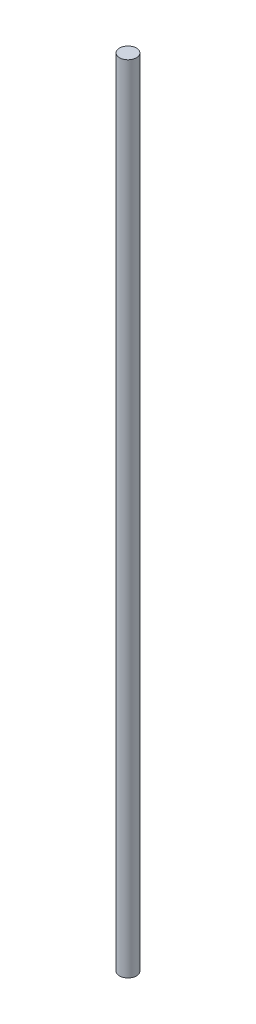
ISO-10303-21;
HEADER;
FILE_DESCRIPTION(('STEP AP214'),'2;1');
FILE_NAME('part.step','',(''),(''),'','','');
FILE_SCHEMA(('AUTOMOTIVE_DESIGN { 1 0 10303 214 1 1 1 1 }'));
ENDSEC;
DATA;
#1=APPLICATION_CONTEXT('core data for automotive mechanical design processes');
#2=APPLICATION_PROTOCOL_DEFINITION('international standard','automotive_design',2000,#1);
#3=PRODUCT_CONTEXT('',#1,'mechanical');
#4=PRODUCT('Part','Part','',(#3));
#5=PRODUCT_RELATED_PRODUCT_CATEGORY('part','',(#4));
#6=PRODUCT_DEFINITION_FORMATION('','',#4);
#7=PRODUCT_DEFINITION_CONTEXT('part definition',#1,'design');
#8=PRODUCT_DEFINITION('design','',#6,#7);
#9=PRODUCT_DEFINITION_SHAPE('','',#8);
#10=(LENGTH_UNIT() NAMED_UNIT(*) SI_UNIT(.MILLI.,.METRE.));
#11=(NAMED_UNIT(*) PLANE_ANGLE_UNIT() SI_UNIT($,.RADIAN.));
#12=(NAMED_UNIT(*) SI_UNIT($,.STERADIAN.) SOLID_ANGLE_UNIT());
#13=UNCERTAINTY_MEASURE_WITH_UNIT(LENGTH_MEASURE(1.E-05),#10,'distance_accuracy_value','');
#14=(GEOMETRIC_REPRESENTATION_CONTEXT(3) GLOBAL_UNCERTAINTY_ASSIGNED_CONTEXT((#13)) GLOBAL_UNIT_ASSIGNED_CONTEXT((#10,
#11,#12)) REPRESENTATION_CONTEXT('',''));
#15=CARTESIAN_POINT('',(0.,0.,0.));
#16=DIRECTION('',(0.,0.,1.));
#17=DIRECTION('',(1.,0.,0.));
#18=AXIS2_PLACEMENT_3D('',#15,#16,#17);
#19=CARTESIAN_POINT('',(0.,377.,0.));
#20=DIRECTION('',(0.,-1.,0.));
#21=DIRECTION('',(0.,0.,-1.));
#22=AXIS2_PLACEMENT_3D('',#19,#20,#21);
#23=CYLINDRICAL_SURFACE('',#22,4.);
#24=CARTESIAN_POINT('',(0.,377.,0.));
#25=DIRECTION('',(0.,1.,0.));
#26=DIRECTION('',(0.,0.,1.));
#27=AXIS2_PLACEMENT_3D('',#24,#25,#26);
#28=CIRCLE('',#27,4.);
#29=CARTESIAN_POINT('',(0.,377.,4.));
#30=VERTEX_POINT('',#29);
#31=EDGE_CURVE('E10',#30,#30,#28,.T.);
#32=ORIENTED_EDGE('',*,*,#31,.F.);
#33=EDGE_LOOP('',(#32));
#34=FACE_BOUND('',#33,.T.);
#35=CARTESIAN_POINT('',(0.,0.,0.));
#36=DIRECTION('',(0.,1.,0.));
#37=DIRECTION('',(0.,0.,1.));
#38=AXIS2_PLACEMENT_3D('',#35,#36,#37);
#39=CIRCLE('',#38,4.);
#40=CARTESIAN_POINT('',(0.,0.,4.));
#41=VERTEX_POINT('',#40);
#42=EDGE_CURVE('E36',#41,#41,#39,.T.);
#43=ORIENTED_EDGE('',*,*,#42,.T.);
#44=EDGE_LOOP('',(#43));
#45=FACE_BOUND('',#44,.T.);
#46=ADVANCED_FACE('F33',(#34,#45),#23,.T.);
#47=CARTESIAN_POINT('',(0.,377.,0.));
#48=DIRECTION('',(0.,1.,0.));
#49=DIRECTION('',(0.,0.,1.));
#50=AXIS2_PLACEMENT_3D('',#47,#48,#49);
#51=PLANE('',#50);
#52=ORIENTED_EDGE('',*,*,#31,.T.);
#53=EDGE_LOOP('',(#52));
#54=FACE_BOUND('',#53,.T.);
#55=ADVANCED_FACE('F48',(#54),#51,.T.);
#56=CARTESIAN_POINT('',(0.,0.,0.));
#57=DIRECTION('',(0.,1.,0.));
#58=DIRECTION('',(0.,0.,1.));
#59=AXIS2_PLACEMENT_3D('',#56,#57,#58);
#60=PLANE('',#59);
#61=ORIENTED_EDGE('',*,*,#42,.F.);
#62=EDGE_LOOP('',(#61));
#63=FACE_BOUND('',#62,.T.);
#64=ADVANCED_FACE('F46',(#63),#60,.F.);
#65=CLOSED_SHELL('',(#46,#55,#64));
#66=MANIFOLD_SOLID_BREP('B2',#65);
#67=ADVANCED_BREP_SHAPE_REPRESENTATION('',(#18,#66),#14);
#68=SHAPE_DEFINITION_REPRESENTATION(#9,#67);
ENDSEC;
END-ISO-10303-21;
